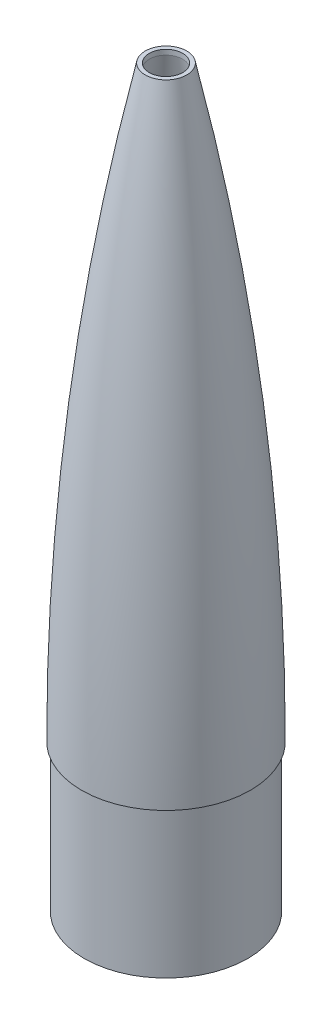
ISO-10303-21;
HEADER;
FILE_DESCRIPTION(('STEP AP214'),'2;1');
FILE_NAME('part.step','',(''),(''),'','','');
FILE_SCHEMA(('AUTOMOTIVE_DESIGN { 1 0 10303 214 1 1 1 1 }'));
ENDSEC;
DATA;
#1=APPLICATION_CONTEXT('core data for automotive mechanical design processes');
#2=APPLICATION_PROTOCOL_DEFINITION('international standard','automotive_design',2000,#1);
#3=PRODUCT_CONTEXT('',#1,'mechanical');
#4=PRODUCT('Part','Part','',(#3));
#5=PRODUCT_RELATED_PRODUCT_CATEGORY('part','',(#4));
#6=PRODUCT_DEFINITION_FORMATION('','',#4);
#7=PRODUCT_DEFINITION_CONTEXT('part definition',#1,'design');
#8=PRODUCT_DEFINITION('design','',#6,#7);
#9=PRODUCT_DEFINITION_SHAPE('','',#8);
#10=(LENGTH_UNIT() NAMED_UNIT(*) SI_UNIT(.MILLI.,.METRE.));
#11=(NAMED_UNIT(*) PLANE_ANGLE_UNIT() SI_UNIT($,.RADIAN.));
#12=(NAMED_UNIT(*) SI_UNIT($,.STERADIAN.) SOLID_ANGLE_UNIT());
#13=UNCERTAINTY_MEASURE_WITH_UNIT(LENGTH_MEASURE(1.E-05),#10,'distance_accuracy_value','');
#14=(GEOMETRIC_REPRESENTATION_CONTEXT(3) GLOBAL_UNCERTAINTY_ASSIGNED_CONTEXT((#13)) GLOBAL_UNIT_ASSIGNED_CONTEXT((#10,
#11,#12)) REPRESENTATION_CONTEXT('',''));
#15=CARTESIAN_POINT('',(0.,0.,0.));
#16=DIRECTION('',(0.,0.,1.));
#17=DIRECTION('',(1.,0.,0.));
#18=AXIS2_PLACEMENT_3D('',#15,#16,#17);
#19=CARTESIAN_POINT('',(0.,0.,0.));
#20=DIRECTION('',(0.,-1.,0.));
#21=DIRECTION('',(0.,0.,-1.));
#22=AXIS2_PLACEMENT_3D('',#19,#20,#21);
#23=CYLINDRICAL_SURFACE('',#22,10.1184035473996);
#24=CARTESIAN_POINT('',(0.,444.5,0.));
#25=DIRECTION('',(0.,-1.,0.));
#26=DIRECTION('',(0.,0.,-1.));
#27=AXIS2_PLACEMENT_3D('',#24,#25,#26);
#28=CIRCLE('',#27,10.1184035473996);
#29=CARTESIAN_POINT('',(0.,444.5,-10.1184035473996));
#30=VERTEX_POINT('',#29);
#31=EDGE_CURVE('E10',#30,#30,#28,.T.);
#32=ORIENTED_EDGE('',*,*,#31,.F.);
#33=EDGE_LOOP('',(#32));
#34=FACE_BOUND('',#33,.T.);
#35=CARTESIAN_POINT('',(0.,441.452,0.));
#36=DIRECTION('',(0.,-1.,0.));
#37=DIRECTION('',(0.,0.,-1.));
#38=AXIS2_PLACEMENT_3D('',#35,#36,#37);
#39=CIRCLE('',#38,10.1184035473996);
#40=CARTESIAN_POINT('',(0.,441.452,-10.1184035473996));
#41=VERTEX_POINT('',#40);
#42=EDGE_CURVE('E68',#41,#41,#39,.T.);
#43=ORIENTED_EDGE('',*,*,#42,.T.);
#44=EDGE_LOOP('',(#43));
#45=FACE_BOUND('',#44,.T.);
#46=ADVANCED_FACE('F39',(#34,#45),#23,.F.);
#47=CARTESIAN_POINT('',(10.1184035473996,444.5,0.));
#48=DIRECTION('',(0.,-1.,0.));
#49=DIRECTION('',(0.,0.,-1.));
#50=AXIS2_PLACEMENT_3D('',#47,#48,#49);
#51=PLANE('',#50);
#52=CARTESIAN_POINT('',(0.,444.5,0.));
#53=DIRECTION('',(0.,-1.,0.));
#54=DIRECTION('',(0.,0.,-1.));
#55=AXIS2_PLACEMENT_3D('',#52,#53,#54);
#56=CIRCLE('',#55,12.5729999999999);
#57=CARTESIAN_POINT('',(0.,444.5,-12.5729999999999));
#58=VERTEX_POINT('',#57);
#59=EDGE_CURVE('E44',#58,#58,#56,.T.);
#60=ORIENTED_EDGE('',*,*,#59,.F.);
#61=EDGE_LOOP('',(#60));
#62=FACE_BOUND('',#61,.T.);
#63=ORIENTED_EDGE('',*,*,#31,.T.);
#64=EDGE_LOOP('',(#63));
#65=FACE_BOUND('',#64,.T.);
#66=ADVANCED_FACE('F87',(#62,#65),#51,.F.);
#67=CARTESIAN_POINT('',(0.,88.9,0.));
#68=DIRECTION('',(0.,-1.,0.));
#69=DIRECTION('',(0.,0.,-1.));
#70=AXIS2_PLACEMENT_3D('',#67,#68,#69);
#71=DEGENERATE_TOROIDAL_SURFACE('',#70,1611.22280363036,1662.27680363036,.F.);
#72=CARTESIAN_POINT('',(0.,88.9,0.));
#73=DIRECTION('',(0.,-1.,0.));
#74=DIRECTION('',(0.,0.,-1.));
#75=AXIS2_PLACEMENT_3D('',#72,#73,#74);
#76=CIRCLE('',#75,51.054);
#77=CARTESIAN_POINT('',(0.,88.9,-51.054));
#78=VERTEX_POINT('',#77);
#79=EDGE_CURVE('E47',#78,#78,#76,.T.);
#80=ORIENTED_EDGE('',*,*,#79,.F.);
#81=EDGE_LOOP('',(#80));
#82=FACE_BOUND('',#81,.T.);
#83=ORIENTED_EDGE('',*,*,#59,.T.);
#84=EDGE_LOOP('',(#83));
#85=FACE_BOUND('',#84,.T.);
#86=ADVANCED_FACE('F95',(#82,#85),#71,.F.);
#87=CARTESIAN_POINT('',(49.53,88.9,0.));
#88=DIRECTION('',(0.,-1.,0.));
#89=DIRECTION('',(0.,0.,-1.));
#90=AXIS2_PLACEMENT_3D('',#87,#88,#89);
#91=PLANE('',#90);
#92=ORIENTED_EDGE('',*,*,#79,.T.);
#93=EDGE_LOOP('',(#92));
#94=FACE_BOUND('',#93,.T.);
#95=CARTESIAN_POINT('',(0.,88.9,0.));
#96=DIRECTION('',(0.,-1.,0.));
#97=DIRECTION('',(0.,0.,-1.));
#98=AXIS2_PLACEMENT_3D('',#95,#96,#97);
#99=CIRCLE('',#98,49.53);
#100=CARTESIAN_POINT('',(0.,88.9,-49.53));
#101=VERTEX_POINT('',#100);
#102=EDGE_CURVE('E52',#101,#101,#99,.T.);
#103=ORIENTED_EDGE('',*,*,#102,.F.);
#104=EDGE_LOOP('',(#103));
#105=FACE_BOUND('',#104,.T.);
#106=ADVANCED_FACE('F100',(#94,#105),#91,.T.);
#107=CARTESIAN_POINT('',(0.,0.,0.));
#108=DIRECTION('',(0.,-1.,0.));
#109=DIRECTION('',(0.,0.,-1.));
#110=AXIS2_PLACEMENT_3D('',#107,#108,#109);
#111=CYLINDRICAL_SURFACE('',#110,49.53);
#112=ORIENTED_EDGE('',*,*,#102,.T.);
#113=EDGE_LOOP('',(#112));
#114=FACE_BOUND('',#113,.T.);
#115=CARTESIAN_POINT('',(0.,0.,0.));
#116=DIRECTION('',(0.,-1.,0.));
#117=DIRECTION('',(0.,0.,-1.));
#118=AXIS2_PLACEMENT_3D('',#115,#116,#117);
#119=CIRCLE('',#118,49.53);
#120=CARTESIAN_POINT('',(0.,0.,-49.53));
#121=VERTEX_POINT('',#120);
#122=EDGE_CURVE('E59',#121,#121,#119,.T.);
#123=ORIENTED_EDGE('',*,*,#122,.F.);
#124=EDGE_LOOP('',(#123));
#125=FACE_BOUND('',#124,.T.);
#126=ADVANCED_FACE('F103',(#114,#125),#111,.T.);
#127=CARTESIAN_POINT('',(46.482,0.,0.));
#128=DIRECTION('',(0.,-1.,0.));
#129=DIRECTION('',(0.,0.,-1.));
#130=AXIS2_PLACEMENT_3D('',#127,#128,#129);
#131=PLANE('',#130);
#132=ORIENTED_EDGE('',*,*,#122,.T.);
#133=EDGE_LOOP('',(#132));
#134=FACE_BOUND('',#133,.T.);
#135=CARTESIAN_POINT('',(0.,0.,0.));
#136=DIRECTION('',(0.,-1.,0.));
#137=DIRECTION('',(0.,0.,-1.));
#138=AXIS2_PLACEMENT_3D('',#135,#136,#137);
#139=CIRCLE('',#138,46.482);
#140=CARTESIAN_POINT('',(0.,0.,-46.482));
#141=VERTEX_POINT('',#140);
#142=EDGE_CURVE('E62',#141,#141,#139,.T.);
#143=ORIENTED_EDGE('',*,*,#142,.F.);
#144=EDGE_LOOP('',(#143));
#145=FACE_BOUND('',#144,.T.);
#146=ADVANCED_FACE('F110',(#134,#145),#131,.T.);
#147=CARTESIAN_POINT('',(0.,0.,0.));
#148=DIRECTION('',(0.,-1.,0.));
#149=DIRECTION('',(0.,0.,-1.));
#150=AXIS2_PLACEMENT_3D('',#147,#148,#149);
#151=CYLINDRICAL_SURFACE('',#150,46.482);
#152=CARTESIAN_POINT('',(0.,91.948,0.));
#153=DIRECTION('',(0.,-1.,0.));
#154=DIRECTION('',(0.,0.,-1.));
#155=AXIS2_PLACEMENT_3D('',#152,#153,#154);
#156=CIRCLE('',#155,46.482);
#157=CARTESIAN_POINT('',(0.,91.948,-46.482));
#158=VERTEX_POINT('',#157);
#159=EDGE_CURVE('E61',#158,#158,#156,.T.);
#160=ORIENTED_EDGE('',*,*,#159,.F.);
#161=EDGE_LOOP('',(#160));
#162=FACE_BOUND('',#161,.T.);
#163=ORIENTED_EDGE('',*,*,#142,.T.);
#164=EDGE_LOOP('',(#163));
#165=FACE_BOUND('',#164,.T.);
#166=ADVANCED_FACE('F81',(#162,#165),#151,.F.);
#167=CARTESIAN_POINT('',(46.482,91.9479999999998,0.));
#168=DIRECTION('',(0.,-1.,0.));
#169=DIRECTION('',(0.,0.,-1.));
#170=AXIS2_PLACEMENT_3D('',#167,#168,#169);
#171=PLANE('',#170);
#172=CARTESIAN_POINT('',(0.,91.9479999999997,0.));
#173=DIRECTION('',(0.,-1.,0.));
#174=DIRECTION('',(0.,0.,-1.));
#175=AXIS2_PLACEMENT_3D('',#172,#173,#174);
#176=CIRCLE('',#175,48.0032004126802);
#177=CARTESIAN_POINT('',(0.,91.9479999999997,-48.0032004126802));
#178=VERTEX_POINT('',#177);
#179=EDGE_CURVE('E69',#178,#178,#176,.T.);
#180=ORIENTED_EDGE('',*,*,#179,.F.);
#181=EDGE_LOOP('',(#180));
#182=FACE_BOUND('',#181,.T.);
#183=ORIENTED_EDGE('',*,*,#159,.T.);
#184=EDGE_LOOP('',(#183));
#185=FACE_BOUND('',#184,.T.);
#186=ADVANCED_FACE('F80',(#182,#185),#171,.F.);
#187=CARTESIAN_POINT('',(0.,88.9,0.));
#188=DIRECTION('',(0.,-1.,0.));
#189=DIRECTION('',(0.,0.,-1.));
#190=AXIS2_PLACEMENT_3D('',#187,#188,#189);
#191=DEGENERATE_TOROIDAL_SURFACE('',#190,1611.22280363036,1659.22880363036,.F.);
#192=ORIENTED_EDGE('',*,*,#179,.T.);
#193=EDGE_LOOP('',(#192));
#194=FACE_BOUND('',#193,.T.);
#195=ORIENTED_EDGE('',*,*,#42,.F.);
#196=EDGE_LOOP('',(#195));
#197=FACE_BOUND('',#196,.T.);
#198=ADVANCED_FACE('F73',(#194,#197),#191,.T.);
#199=CLOSED_SHELL('',(#46,#66,#86,#106,#126,#146,#166,#186,#198));
#200=MANIFOLD_SOLID_BREP('B2',#199);
#201=ADVANCED_BREP_SHAPE_REPRESENTATION('',(#18,#200),#14);
#202=SHAPE_DEFINITION_REPRESENTATION(#9,#201);
ENDSEC;
END-ISO-10303-21;
